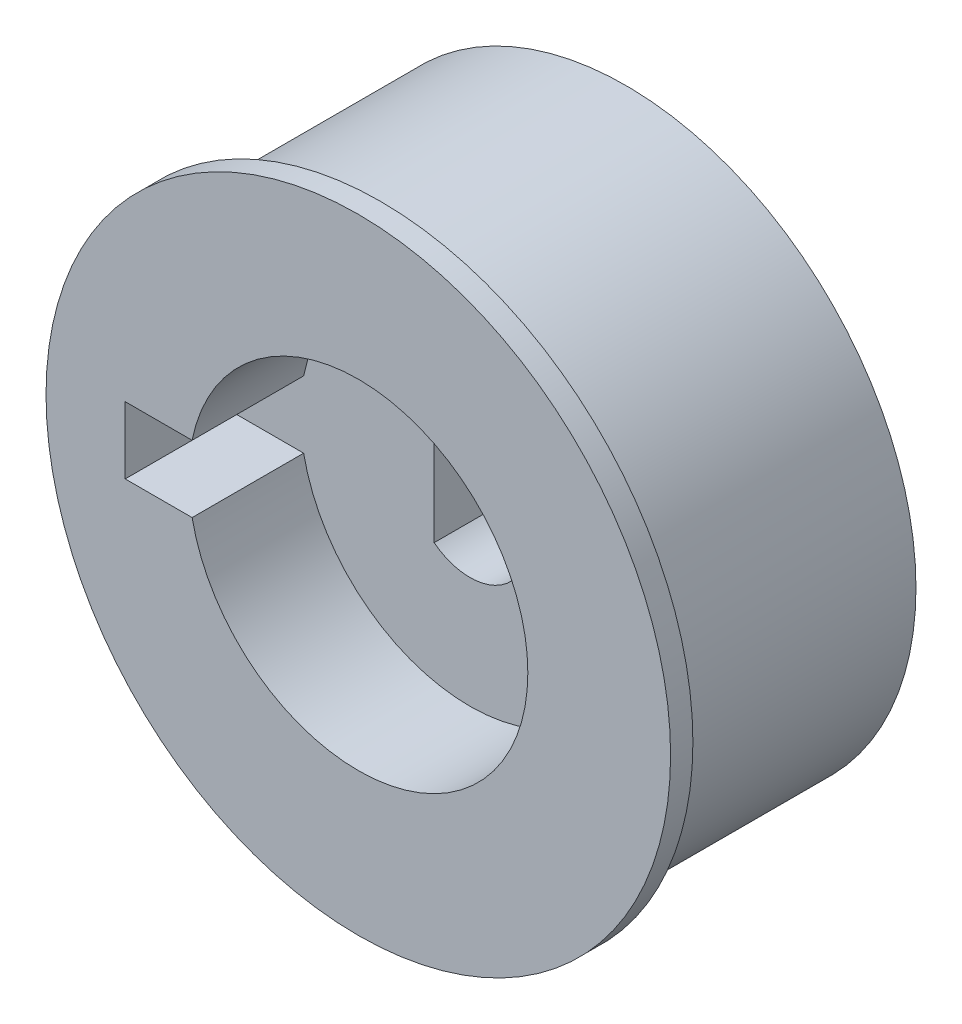
ISO-10303-21;
HEADER;
FILE_DESCRIPTION(('STEP AP214'),'2;1');
FILE_NAME('part.step','',(''),(''),'','','');
FILE_SCHEMA(('AUTOMOTIVE_DESIGN { 1 0 10303 214 1 1 1 1 }'));
ENDSEC;
DATA;
#1=APPLICATION_CONTEXT('core data for automotive mechanical design processes');
#2=APPLICATION_PROTOCOL_DEFINITION('international standard','automotive_design',2000,#1);
#3=PRODUCT_CONTEXT('',#1,'mechanical');
#4=PRODUCT('Part','Part','',(#3));
#5=PRODUCT_RELATED_PRODUCT_CATEGORY('part','',(#4));
#6=PRODUCT_DEFINITION_FORMATION('','',#4);
#7=PRODUCT_DEFINITION_CONTEXT('part definition',#1,'design');
#8=PRODUCT_DEFINITION('design','',#6,#7);
#9=PRODUCT_DEFINITION_SHAPE('','',#8);
#10=(LENGTH_UNIT() NAMED_UNIT(*) SI_UNIT(.MILLI.,.METRE.));
#11=(NAMED_UNIT(*) PLANE_ANGLE_UNIT() SI_UNIT($,.RADIAN.));
#12=(NAMED_UNIT(*) SI_UNIT($,.STERADIAN.) SOLID_ANGLE_UNIT());
#13=UNCERTAINTY_MEASURE_WITH_UNIT(LENGTH_MEASURE(1.E-05),#10,'distance_accuracy_value','');
#14=(GEOMETRIC_REPRESENTATION_CONTEXT(3) GLOBAL_UNCERTAINTY_ASSIGNED_CONTEXT((#13)) GLOBAL_UNIT_ASSIGNED_CONTEXT((#10,
#11,#12)) REPRESENTATION_CONTEXT('',''));
#15=CARTESIAN_POINT('',(0.,0.,0.));
#16=DIRECTION('',(0.,0.,1.));
#17=DIRECTION('',(1.,0.,0.));
#18=AXIS2_PLACEMENT_3D('',#15,#16,#17);
#19=CARTESIAN_POINT('',(0.,0.,12.));
#20=DIRECTION('',(0.,0.,-1.));
#21=DIRECTION('',(-1.,0.,0.));
#22=AXIS2_PLACEMENT_3D('',#19,#20,#21);
#23=CYLINDRICAL_SURFACE('',#22,2.6);
#24=DIRECTION('',(0.,0.,-1.));
#25=VECTOR('',#24,1.);
#26=CARTESIAN_POINT('',(-1.6,-2.04939015319192,12.));
#27=LINE('',#26,#25);
#28=CARTESIAN_POINT('',(-1.6,-2.04939015319192,7.));
#29=VERTEX_POINT('',#28);
#30=CARTESIAN_POINT('',(-1.6,-2.04939015319192,4.));
#31=VERTEX_POINT('',#30);
#32=EDGE_CURVE('E501',#29,#31,#27,.T.);
#33=ORIENTED_EDGE('',*,*,#32,.F.);
#34=CARTESIAN_POINT('',(0.,0.,7.));
#35=DIRECTION('',(0.,0.,1.));
#36=DIRECTION('',(1.,0.,0.));
#37=AXIS2_PLACEMENT_3D('',#34,#35,#36);
#38=CIRCLE('',#37,2.6);
#39=CARTESIAN_POINT('',(-1.6,2.04939015319192,7.));
#40=VERTEX_POINT('',#39);
#41=EDGE_CURVE('E325',#40,#29,#38,.F.);
#42=ORIENTED_EDGE('',*,*,#41,.F.);
#43=DIRECTION('',(0.,0.,-1.));
#44=VECTOR('',#43,1.);
#45=CARTESIAN_POINT('',(-1.6,2.04939015319192,12.));
#46=LINE('',#45,#44);
#47=CARTESIAN_POINT('',(-1.6,2.04939015319192,4.));
#48=VERTEX_POINT('',#47);
#49=EDGE_CURVE('E495',#40,#48,#46,.T.);
#50=ORIENTED_EDGE('',*,*,#49,.T.);
#51=CARTESIAN_POINT('',(0.,0.,4.));
#52=DIRECTION('',(0.,0.,1.));
#53=DIRECTION('',(1.,0.,0.));
#54=AXIS2_PLACEMENT_3D('',#51,#52,#53);
#55=CIRCLE('',#54,2.6);
#56=EDGE_CURVE('E508',#48,#31,#55,.F.);
#57=ORIENTED_EDGE('',*,*,#56,.T.);
#58=EDGE_LOOP('',(#33,#42,#50,#57));
#59=FACE_BOUND('',#58,.T.);
#60=ADVANCED_FACE('F97',(#59),#23,.F.);
#61=CARTESIAN_POINT('',(-1.6,0.,12.));
#62=DIRECTION('',(1.,0.,0.));
#63=DIRECTION('',(0.,0.,-1.));
#64=AXIS2_PLACEMENT_3D('',#61,#62,#63);
#65=PLANE('',#64);
#66=ORIENTED_EDGE('',*,*,#49,.F.);
#67=DIRECTION('',(0.,1.,0.));
#68=VECTOR('',#67,1.);
#69=CARTESIAN_POINT('',(-1.6,0.,7.));
#70=LINE('',#69,#68);
#71=EDGE_CURVE('E328',#29,#40,#70,.T.);
#72=ORIENTED_EDGE('',*,*,#71,.F.);
#73=ORIENTED_EDGE('',*,*,#32,.T.);
#74=DIRECTION('',(0.,1.,0.));
#75=VECTOR('',#74,1.);
#76=CARTESIAN_POINT('',(-1.6,0.,4.));
#77=LINE('',#76,#75);
#78=EDGE_CURVE('E504',#31,#48,#77,.T.);
#79=ORIENTED_EDGE('',*,*,#78,.T.);
#80=EDGE_LOOP('',(#66,#72,#73,#79));
#81=FACE_BOUND('',#80,.T.);
#82=ADVANCED_FACE('F599',(#81),#65,.T.);
#83=CARTESIAN_POINT('',(0.,0.,12.));
#84=DIRECTION('',(0.,0.,1.));
#85=DIRECTION('',(1.,0.,0.));
#86=AXIS2_PLACEMENT_3D('',#83,#84,#85);
#87=PLANE('',#86);
#88=CARTESIAN_POINT('',(0.,0.,12.));
#89=DIRECTION('',(0.,0.,1.));
#90=DIRECTION('',(1.,0.,0.));
#91=AXIS2_PLACEMENT_3D('',#88,#89,#90);
#92=CIRCLE('',#91,14.);
#93=CARTESIAN_POINT('',(14.,0.,12.));
#94=VERTEX_POINT('',#93);
#95=EDGE_CURVE('E491',#94,#94,#92,.T.);
#96=ORIENTED_EDGE('',*,*,#95,.T.);
#97=EDGE_LOOP('',(#96));
#98=FACE_BOUND('',#97,.T.);
#99=CARTESIAN_POINT('',(0.,0.,12.));
#100=DIRECTION('',(0.,0.,1.));
#101=DIRECTION('',(1.,0.,0.));
#102=AXIS2_PLACEMENT_3D('',#99,#100,#101);
#103=CIRCLE('',#102,7.6);
#104=CARTESIAN_POINT('',(-7.45050333870135,-1.5,12.));
#105=VERTEX_POINT('',#104);
#106=CARTESIAN_POINT('',(-7.45050333870135,1.5,12.));
#107=VERTEX_POINT('',#106);
#108=EDGE_CURVE('E351',#105,#107,#103,.T.);
#109=ORIENTED_EDGE('',*,*,#108,.F.);
#110=DIRECTION('',(-1.,0.,0.));
#111=VECTOR('',#110,1.);
#112=CARTESIAN_POINT('',(0.,-1.5,12.));
#113=LINE('',#112,#111);
#114=CARTESIAN_POINT('',(-10.4505033387014,-1.5,12.));
#115=VERTEX_POINT('',#114);
#116=EDGE_CURVE('E324',#105,#115,#113,.T.);
#117=ORIENTED_EDGE('',*,*,#116,.T.);
#118=DIRECTION('',(0.,1.,0.));
#119=VECTOR('',#118,1.);
#120=CARTESIAN_POINT('',(-10.4505033387014,0.,12.));
#121=LINE('',#120,#119);
#122=CARTESIAN_POINT('',(-10.4505033387014,1.5,12.));
#123=VERTEX_POINT('',#122);
#124=EDGE_CURVE('E329',#115,#123,#121,.T.);
#125=ORIENTED_EDGE('',*,*,#124,.T.);
#126=DIRECTION('',(-1.,0.,0.));
#127=VECTOR('',#126,1.);
#128=CARTESIAN_POINT('',(0.,1.5,12.));
#129=LINE('',#128,#127);
#130=EDGE_CURVE('E355',#107,#123,#129,.T.);
#131=ORIENTED_EDGE('',*,*,#130,.F.);
#132=EDGE_LOOP('',(#109,#117,#125,#131));
#133=FACE_BOUND('',#132,.T.);
#134=ADVANCED_FACE('F605',(#98,#133),#87,.T.);
#135=CARTESIAN_POINT('',(0.,0.,4.));
#136=DIRECTION('',(0.,0.,-1.));
#137=DIRECTION('',(-1.,0.,0.));
#138=AXIS2_PLACEMENT_3D('',#135,#136,#137);
#139=CYLINDRICAL_SURFACE('',#138,13.);
#140=CARTESIAN_POINT('',(0.,0.,0.));
#141=DIRECTION('',(0.,0.,1.));
#142=DIRECTION('',(1.,0.,0.));
#143=AXIS2_PLACEMENT_3D('',#140,#141,#142);
#144=CIRCLE('',#143,13.);
#145=CARTESIAN_POINT('',(13.,0.,0.));
#146=VERTEX_POINT('',#145);
#147=EDGE_CURVE('E512',#146,#146,#144,.T.);
#148=ORIENTED_EDGE('',*,*,#147,.T.);
#149=EDGE_LOOP('',(#148));
#150=FACE_BOUND('',#149,.T.);
#151=CARTESIAN_POINT('',(0.,0.,11.));
#152=DIRECTION('',(0.,0.,1.));
#153=DIRECTION('',(1.,0.,0.));
#154=AXIS2_PLACEMENT_3D('',#151,#152,#153);
#155=CIRCLE('',#154,13.);
#156=CARTESIAN_POINT('',(13.,0.,11.));
#157=VERTEX_POINT('',#156);
#158=EDGE_CURVE('E517',#157,#157,#155,.T.);
#159=ORIENTED_EDGE('',*,*,#158,.F.);
#160=EDGE_LOOP('',(#159));
#161=FACE_BOUND('',#160,.T.);
#162=ADVANCED_FACE('F621',(#150,#161),#139,.T.);
#163=CARTESIAN_POINT('',(0.,0.,4.));
#164=DIRECTION('',(0.,0.,-1.));
#165=DIRECTION('',(-1.,0.,0.));
#166=AXIS2_PLACEMENT_3D('',#163,#164,#165);
#167=CYLINDRICAL_SURFACE('',#166,1.4);
#168=CARTESIAN_POINT('',(0.,0.,2.));
#169=DIRECTION('',(0.,0.,1.));
#170=DIRECTION('',(1.,0.,0.));
#171=AXIS2_PLACEMENT_3D('',#168,#169,#170);
#172=CIRCLE('',#171,1.4);
#173=CARTESIAN_POINT('',(1.4,0.,2.));
#174=VERTEX_POINT('',#173);
#175=EDGE_CURVE('E283',#174,#174,#172,.T.);
#176=ORIENTED_EDGE('',*,*,#175,.F.);
#177=EDGE_LOOP('',(#176));
#178=FACE_BOUND('',#177,.T.);
#179=CARTESIAN_POINT('',(0.,0.,4.));
#180=DIRECTION('',(0.,0.,1.));
#181=DIRECTION('',(1.,0.,0.));
#182=AXIS2_PLACEMENT_3D('',#179,#180,#181);
#183=CIRCLE('',#182,1.4);
#184=CARTESIAN_POINT('',(1.4,0.,4.));
#185=VERTEX_POINT('',#184);
#186=EDGE_CURVE('E513',#185,#185,#183,.T.);
#187=ORIENTED_EDGE('',*,*,#186,.T.);
#188=EDGE_LOOP('',(#187));
#189=FACE_BOUND('',#188,.T.);
#190=ADVANCED_FACE('F615',(#178,#189),#167,.F.);
#191=CARTESIAN_POINT('',(0.,0.,4.));
#192=DIRECTION('',(0.,0.,1.));
#193=DIRECTION('',(1.,0.,0.));
#194=AXIS2_PLACEMENT_3D('',#191,#192,#193);
#195=PLANE('',#194);
#196=ORIENTED_EDGE('',*,*,#56,.F.);
#197=ORIENTED_EDGE('',*,*,#78,.F.);
#198=EDGE_LOOP('',(#196,#197));
#199=FACE_BOUND('',#198,.T.);
#200=ORIENTED_EDGE('',*,*,#186,.F.);
#201=EDGE_LOOP('',(#200));
#202=FACE_BOUND('',#201,.T.);
#203=ADVANCED_FACE('F611',(#199,#202),#195,.T.);
#204=CARTESIAN_POINT('',(0.,0.,0.));
#205=DIRECTION('',(0.,0.,1.));
#206=DIRECTION('',(1.,0.,0.));
#207=AXIS2_PLACEMENT_3D('',#204,#205,#206);
#208=PLANE('',#207);
#209=DIRECTION('',(-0.866025403784429,-0.500000000000016,0.));
#210=VECTOR('',#209,1.);
#211=CARTESIAN_POINT('',(-0.375000000000013,0.649519052838322,0.));
#212=LINE('',#211,#210);
#213=CARTESIAN_POINT('',(-10.4287304944647,-5.15500495450106,0.));
#214=VERTEX_POINT('',#213);
#215=CARTESIAN_POINT('',(-10.7469875144544,-5.33875073066362,0.));
#216=VERTEX_POINT('',#215);
#217=EDGE_CURVE('E386',#214,#216,#212,.T.);
#218=ORIENTED_EDGE('',*,*,#217,.F.);
#219=CARTESIAN_POINT('',(0.,0.,0.));
#220=DIRECTION('',(0.,0.,1.));
#221=DIRECTION('',(1.,0.,0.));
#222=AXIS2_PLACEMENT_3D('',#219,#220,#221);
#223=CIRCLE('',#222,11.6332495807108);
#224=CARTESIAN_POINT('',(-9.67873049446467,-6.45404306017771,0.));
#225=VERTEX_POINT('',#224);
#226=EDGE_CURVE('E671',#214,#225,#223,.T.);
#227=ORIENTED_EDGE('',*,*,#226,.T.);
#228=DIRECTION('',(-0.866025403784429,-0.500000000000016,0.));
#229=VECTOR('',#228,1.);
#230=CARTESIAN_POINT('',(0.375000000000013,-0.649519052838324,0.));
#231=LINE('',#230,#229);
#232=CARTESIAN_POINT('',(-9.99698751445438,-6.63778883634026,0.));
#233=VERTEX_POINT('',#232);
#234=EDGE_CURVE('E416',#225,#233,#231,.T.);
#235=ORIENTED_EDGE('',*,*,#234,.T.);
#236=CARTESIAN_POINT('',(0.,0.,0.));
#237=DIRECTION('',(0.,0.,-1.));
#238=DIRECTION('',(-1.,0.,0.));
#239=AXIS2_PLACEMENT_3D('',#236,#237,#238);
#240=CIRCLE('',#239,12.);
#241=CARTESIAN_POINT('',(9.99698751445451,-6.63778883634007,0.));
#242=VERTEX_POINT('',#241);
#243=EDGE_CURVE('E421',#242,#233,#240,.T.);
#244=ORIENTED_EDGE('',*,*,#243,.F.);
#245=DIRECTION('',(0.866025403784432,-0.500000000000011,0.));
#246=VECTOR('',#245,1.);
#247=CARTESIAN_POINT('',(-0.374999999999925,-0.64951905283818,0.));
#248=LINE('',#247,#246);
#249=CARTESIAN_POINT('',(9.67873049446479,-6.45404306017751,0.));
#250=VERTEX_POINT('',#249);
#251=EDGE_CURVE('E426',#250,#242,#248,.T.);
#252=ORIENTED_EDGE('',*,*,#251,.F.);
#253=CARTESIAN_POINT('',(0.,0.,0.));
#254=DIRECTION('',(0.,0.,1.));
#255=DIRECTION('',(1.,0.,0.));
#256=AXIS2_PLACEMENT_3D('',#253,#254,#255);
#257=CIRCLE('',#256,11.6332495807108);
#258=CARTESIAN_POINT('',(10.4287304944648,-5.15500495450085,0.));
#259=VERTEX_POINT('',#258);
#260=EDGE_CURVE('E119',#250,#259,#257,.T.);
#261=ORIENTED_EDGE('',*,*,#260,.T.);
#262=DIRECTION('',(0.866025403784432,-0.500000000000012,0.));
#263=VECTOR('',#262,1.);
#264=CARTESIAN_POINT('',(0.375000000000093,0.64951905283847,0.));
#265=LINE('',#264,#263);
#266=CARTESIAN_POINT('',(10.7469875144545,-5.33875073066341,0.));
#267=VERTEX_POINT('',#266);
#268=EDGE_CURVE('E271',#259,#267,#265,.T.);
#269=ORIENTED_EDGE('',*,*,#268,.T.);
#270=CARTESIAN_POINT('',(0.,0.,0.));
#271=DIRECTION('',(0.,0.,-1.));
#272=DIRECTION('',(-1.,0.,0.));
#273=AXIS2_PLACEMENT_3D('',#270,#271,#272);
#274=CIRCLE('',#273,12.);
#275=CARTESIAN_POINT('',(0.75,11.9765395670035,0.));
#276=VERTEX_POINT('',#275);
#277=EDGE_CURVE('E459',#276,#267,#274,.T.);
#278=ORIENTED_EDGE('',*,*,#277,.F.);
#279=DIRECTION('',(0.,1.,0.));
#280=VECTOR('',#279,1.);
#281=CARTESIAN_POINT('',(0.75,0.,0.));
#282=LINE('',#281,#280);
#283=CARTESIAN_POINT('',(0.75,11.6090480146784,0.));
#284=VERTEX_POINT('',#283);
#285=EDGE_CURVE('E464',#284,#276,#282,.T.);
#286=ORIENTED_EDGE('',*,*,#285,.F.);
#287=CARTESIAN_POINT('',(0.,0.,0.));
#288=DIRECTION('',(0.,0.,1.));
#289=DIRECTION('',(1.,0.,0.));
#290=AXIS2_PLACEMENT_3D('',#287,#288,#289);
#291=CIRCLE('',#290,11.6332495807108);
#292=CARTESIAN_POINT('',(-0.75,11.6090480146784,0.));
#293=VERTEX_POINT('',#292);
#294=EDGE_CURVE('E536',#284,#293,#291,.T.);
#295=ORIENTED_EDGE('',*,*,#294,.T.);
#296=DIRECTION('',(0.,1.,0.));
#297=VECTOR('',#296,1.);
#298=CARTESIAN_POINT('',(-0.75,0.,0.));
#299=LINE('',#298,#297);
#300=CARTESIAN_POINT('',(-0.75,11.9765395670035,0.));
#301=VERTEX_POINT('',#300);
#302=EDGE_CURVE('E376',#293,#301,#299,.T.);
#303=ORIENTED_EDGE('',*,*,#302,.T.);
#304=CARTESIAN_POINT('',(0.,0.,0.));
#305=DIRECTION('',(0.,0.,-1.));
#306=DIRECTION('',(-1.,0.,0.));
#307=AXIS2_PLACEMENT_3D('',#304,#305,#306);
#308=CIRCLE('',#307,12.);
#309=EDGE_CURVE('E381',#216,#301,#308,.T.);
#310=ORIENTED_EDGE('',*,*,#309,.F.);
#311=EDGE_LOOP('',(#218,#227,#235,#244,#252,#261,#269,#278,#286,#295,#303,#310));
#312=FACE_BOUND('',#311,.T.);
#313=ORIENTED_EDGE('',*,*,#147,.F.);
#314=EDGE_LOOP('',(#313));
#315=FACE_BOUND('',#314,.T.);
#316=ADVANCED_FACE('F614',(#312,#315),#208,.F.);
#317=CARTESIAN_POINT('',(0.,0.,12.));
#318=DIRECTION('',(0.,0.,-1.));
#319=DIRECTION('',(-1.,0.,0.));
#320=AXIS2_PLACEMENT_3D('',#317,#318,#319);
#321=CYLINDRICAL_SURFACE('',#320,14.);
#322=ORIENTED_EDGE('',*,*,#95,.F.);
#323=EDGE_LOOP('',(#322));
#324=FACE_BOUND('',#323,.T.);
#325=CARTESIAN_POINT('',(0.,0.,11.));
#326=DIRECTION('',(0.,0.,1.));
#327=DIRECTION('',(1.,0.,0.));
#328=AXIS2_PLACEMENT_3D('',#325,#326,#327);
#329=CIRCLE('',#328,14.);
#330=CARTESIAN_POINT('',(14.,0.,11.));
#331=VERTEX_POINT('',#330);
#332=EDGE_CURVE('E490',#331,#331,#329,.T.);
#333=ORIENTED_EDGE('',*,*,#332,.T.);
#334=EDGE_LOOP('',(#333));
#335=FACE_BOUND('',#334,.T.);
#336=ADVANCED_FACE('F619',(#324,#335),#321,.T.);
#337=CARTESIAN_POINT('',(0.,0.,11.));
#338=DIRECTION('',(0.,0.,1.));
#339=DIRECTION('',(1.,0.,0.));
#340=AXIS2_PLACEMENT_3D('',#337,#338,#339);
#341=PLANE('',#340);
#342=ORIENTED_EDGE('',*,*,#158,.T.);
#343=EDGE_LOOP('',(#342));
#344=FACE_BOUND('',#343,.T.);
#345=ORIENTED_EDGE('',*,*,#332,.F.);
#346=EDGE_LOOP('',(#345));
#347=FACE_BOUND('',#346,.T.);
#348=ADVANCED_FACE('F633',(#344,#347),#341,.F.);
#349=CARTESIAN_POINT('',(0.,0.,5.));
#350=DIRECTION('',(0.,0.,1.));
#351=DIRECTION('',(1.,0.,0.));
#352=AXIS2_PLACEMENT_3D('',#349,#350,#351);
#353=PLANE('',#352);
#354=DIRECTION('',(0.,1.,0.));
#355=VECTOR('',#354,1.);
#356=CARTESIAN_POINT('',(0.75,0.,5.));
#357=LINE('',#356,#355);
#358=CARTESIAN_POINT('',(0.75,4.53844687090198,5.));
#359=VERTEX_POINT('',#358);
#360=CARTESIAN_POINT('',(0.75,11.9765395670035,5.));
#361=VERTEX_POINT('',#360);
#362=EDGE_CURVE('E472',#359,#361,#357,.T.);
#363=ORIENTED_EDGE('',*,*,#362,.T.);
#364=CARTESIAN_POINT('',(0.,0.,5.));
#365=DIRECTION('',(0.,0.,1.));
#366=DIRECTION('',(1.,0.,0.));
#367=AXIS2_PLACEMENT_3D('',#364,#365,#366);
#368=CIRCLE('',#367,12.);
#369=CARTESIAN_POINT('',(10.7469875144545,-5.33875073066341,5.));
#370=VERTEX_POINT('',#369);
#371=EDGE_CURVE('E463',#361,#370,#368,.F.);
#372=ORIENTED_EDGE('',*,*,#371,.T.);
#373=DIRECTION('',(0.866025403784432,-0.500000000000012,0.));
#374=VECTOR('',#373,1.);
#375=CARTESIAN_POINT('',(0.375000000000093,0.64951905283847,5.));
#376=LINE('',#375,#374);
#377=CARTESIAN_POINT('',(4.30541028392715,-1.61970438261256,5.));
#378=VERTEX_POINT('',#377);
#379=EDGE_CURVE('E467',#378,#370,#376,.T.);
#380=ORIENTED_EDGE('',*,*,#379,.F.);
#381=CARTESIAN_POINT('',(0.,0.,5.));
#382=DIRECTION('',(0.,0.,1.));
#383=DIRECTION('',(1.,0.,0.));
#384=AXIS2_PLACEMENT_3D('',#381,#382,#383);
#385=CIRCLE('',#384,4.6);
#386=EDGE_CURVE('E455',#359,#378,#385,.F.);
#387=ORIENTED_EDGE('',*,*,#386,.F.);
#388=EDGE_LOOP('',(#363,#372,#380,#387));
#389=FACE_BOUND('',#388,.T.);
#390=ADVANCED_FACE('F636',(#389),#353,.F.);
#391=CARTESIAN_POINT('',(0.,0.,33.9596966156328));
#392=DIRECTION('',(0.,0.,-1.));
#393=DIRECTION('',(-1.,0.,0.));
#394=AXIS2_PLACEMENT_3D('',#391,#392,#393);
#395=CYLINDRICAL_SURFACE('',#394,12.);
#396=DIRECTION('',(0.,0.,-1.));
#397=VECTOR('',#396,1.);
#398=CARTESIAN_POINT('',(0.75,11.9765395670035,33.9596966156328));
#399=LINE('',#398,#397);
#400=EDGE_CURVE('E476',#361,#276,#399,.T.);
#401=ORIENTED_EDGE('',*,*,#400,.T.);
#402=ORIENTED_EDGE('',*,*,#277,.T.);
#403=DIRECTION('',(0.,0.,-1.));
#404=VECTOR('',#403,1.);
#405=CARTESIAN_POINT('',(10.7469875144545,-5.33875073066341,33.9596966156328));
#406=LINE('',#405,#404);
#407=EDGE_CURVE('E471',#370,#267,#406,.T.);
#408=ORIENTED_EDGE('',*,*,#407,.F.);
#409=ORIENTED_EDGE('',*,*,#371,.F.);
#410=EDGE_LOOP('',(#401,#402,#408,#409));
#411=FACE_BOUND('',#410,.T.);
#412=ADVANCED_FACE('F649',(#411),#395,.F.);
#413=CARTESIAN_POINT('',(0.375000000000093,0.64951905283847,33.9596966156328));
#414=DIRECTION('',(0.500000000000012,0.866025403784432,0.));
#415=DIRECTION('',(-0.866025403784432,0.500000000000012,0.));
#416=AXIS2_PLACEMENT_3D('',#413,#414,#415);
#417=PLANE('',#416);
#418=ORIENTED_EDGE('',*,*,#268,.F.);
#419=CARTESIAN_POINT('',(10.4287304944648,-5.15500495450085,0.));
#420=CARTESIAN_POINT('',(10.1312042262057,-4.9832280834305,-4.18353302775018E-05));
#421=CARTESIAN_POINT('',(9.83368081164115,-4.81145285994141,0.0146900329256624));
#422=CARTESIAN_POINT('',(9.24077476566226,-4.46913839469133,0.0733775169514432));
#423=CARTESIAN_POINT('',(8.94539233244648,-4.29859926736031,0.117335804253457));
#424=CARTESIAN_POINT('',(8.36589995423224,-3.96402918680497,0.232769633331213));
#425=CARTESIAN_POINT('',(8.08168869222404,-3.79993973817781,0.303569112871464));
#426=CARTESIAN_POINT('',(7.51938466553235,-3.47529335700094,0.472143949845235));
#427=CARTESIAN_POINT('',(7.24129042056458,-3.31473556980871,0.569912701563236));
#428=CARTESIAN_POINT('',(6.765729624024,-3.04017041590996,0.762271236609839));
#429=CARTESIAN_POINT('',(6.56641837481452,-2.92509801252634,0.85084312114458));
#430=CARTESIAN_POINT('',(6.17281342365751,-2.69785008802147,1.04177444744678));
#431=CARTESIAN_POINT('',(5.97851945865076,-2.5856744150229,1.14413316460604));
#432=CARTESIAN_POINT('',(5.59223707930897,-2.3626541793267,1.36415151266648));
#433=CARTESIAN_POINT('',(5.40035116164338,-2.25186879310877,1.48205093923393));
#434=CARTESIAN_POINT('',(5.02314416644525,-2.03408823289092,1.73117049838268));
#435=CARTESIAN_POINT('',(4.83782394212901,-1.92709355149565,1.86239235371987));
#436=CARTESIAN_POINT('',(4.65613594738597,-1.82219593882222,2.));
#437=B_SPLINE_CURVE_WITH_KNOTS('',3,(#419,#420,#421,#422,#423,#424,#425,#426,#427,#428,#429,
#430,#431,#432,#433,#434,#435,#436),.UNSPECIFIED.,.F.,.F.,(4,2,2,2,2,2,2,2,4),(0.,
1.03034431508331,2.06078282495963,3.06682736134476,4.07262570079603,4.81200093428171,
5.55133732284493,6.30382570151409,7.0564115105371),.UNSPECIFIED.);
#438=CARTESIAN_POINT('',(4.65613594738597,-1.82219593882222,2.));
#439=VERTEX_POINT('',#438);
#440=EDGE_CURVE('E264',#259,#439,#437,.T.);
#441=ORIENTED_EDGE('',*,*,#440,.T.);
#442=DIRECTION('',(0.866025403784432,-0.500000000000012,0.));
#443=VECTOR('',#442,1.);
#444=CARTESIAN_POINT('',(0.375000000000093,0.64951905283847,2.));
#445=LINE('',#444,#443);
#446=CARTESIAN_POINT('',(4.30541028392715,-1.61970438261256,2.));
#447=VERTEX_POINT('',#446);
#448=EDGE_CURVE('E268',#447,#439,#445,.T.);
#449=ORIENTED_EDGE('',*,*,#448,.F.);
#450=DIRECTION('',(0.,0.,-1.));
#451=VECTOR('',#450,1.);
#452=CARTESIAN_POINT('',(4.30541028392715,-1.61970438261256,33.9596966156328));
#453=LINE('',#452,#451);
#454=EDGE_CURVE('E458',#378,#447,#453,.T.);
#455=ORIENTED_EDGE('',*,*,#454,.F.);
#456=ORIENTED_EDGE('',*,*,#379,.T.);
#457=ORIENTED_EDGE('',*,*,#407,.T.);
#458=EDGE_LOOP('',(#418,#441,#449,#455,#456,#457));
#459=FACE_BOUND('',#458,.T.);
#460=ADVANCED_FACE('F266',(#459),#417,.T.);
#461=CARTESIAN_POINT('',(0.,0.,33.9596966156328));
#462=DIRECTION('',(0.,0.,-1.));
#463=DIRECTION('',(-1.,0.,0.));
#464=AXIS2_PLACEMENT_3D('',#461,#462,#463);
#465=CYLINDRICAL_SURFACE('',#464,4.6);
#466=CARTESIAN_POINT('',(0.,0.,2.));
#467=DIRECTION('',(0.,0.,1.));
#468=DIRECTION('',(1.,0.,0.));
#469=AXIS2_PLACEMENT_3D('',#466,#467,#468);
#470=CIRCLE('',#469,4.6);
#471=CARTESIAN_POINT('',(0.75,4.53844687090198,2.));
#472=VERTEX_POINT('',#471);
#473=EDGE_CURVE('E281',#472,#447,#470,.F.);
#474=ORIENTED_EDGE('',*,*,#473,.F.);
#475=DIRECTION('',(0.,0.,-1.));
#476=VECTOR('',#475,1.);
#477=CARTESIAN_POINT('',(0.75,4.53844687090198,33.9596966156328));
#478=LINE('',#477,#476);
#479=EDGE_CURVE('E311',#359,#472,#478,.T.);
#480=ORIENTED_EDGE('',*,*,#479,.F.);
#481=ORIENTED_EDGE('',*,*,#386,.T.);
#482=ORIENTED_EDGE('',*,*,#454,.T.);
#483=EDGE_LOOP('',(#474,#480,#481,#482));
#484=FACE_BOUND('',#483,.T.);
#485=ADVANCED_FACE('F656',(#484),#465,.T.);
#486=CARTESIAN_POINT('',(0.75,0.,33.9596966156328));
#487=DIRECTION('',(-1.,0.,0.));
#488=DIRECTION('',(0.,0.,1.));
#489=AXIS2_PLACEMENT_3D('',#486,#487,#488);
#490=PLANE('',#489);
#491=DIRECTION('',(0.,1.,0.));
#492=VECTOR('',#491,1.);
#493=CARTESIAN_POINT('',(0.75,0.,2.));
#494=LINE('',#493,#492);
#495=CARTESIAN_POINT('',(0.75,4.9434299833213,2.));
#496=VERTEX_POINT('',#495);
#497=EDGE_CURVE('E301',#472,#496,#494,.T.);
#498=ORIENTED_EDGE('',*,*,#497,.T.);
#499=CARTESIAN_POINT('',(0.75,4.9434299833213,2.));
#500=CARTESIAN_POINT('',(0.75,5.0893474821141,1.90430312472398));
#501=CARTESIAN_POINT('',(0.75,5.23726701669011,1.81169705960343));
#502=CARTESIAN_POINT('',(0.75,5.53690051696032,1.63283795454836));
#503=CARTESIAN_POINT('',(0.75,5.68861452876567,1.54658499186814));
#504=CARTESIAN_POINT('',(0.75,6.14913504735836,1.29761266497216));
#505=CARTESIAN_POINT('',(0.75,6.4633137120764,1.14468401311426));
#506=CARTESIAN_POINT('',(0.75,7.0958536228182,0.869710166692756));
#507=CARTESIAN_POINT('',(0.75,7.41393130203221,0.747009152436511));
#508=CARTESIAN_POINT('',(0.75,8.05921576711693,0.528796518198928));
#509=CARTESIAN_POINT('',(0.75,8.38641967939893,0.433276443510317));
#510=CARTESIAN_POINT('',(0.75,8.95127464357346,0.293933085677098));
#511=CARTESIAN_POINT('',(0.75,9.18723710837479,0.243156349625265));
#512=CARTESIAN_POINT('',(0.75,9.66177503960559,0.155811064934727));
#513=CARTESIAN_POINT('',(0.75,9.90035033047808,0.119241567654459));
#514=CARTESIAN_POINT('',(0.75,10.3834396548991,0.0599523100500162));
#515=CARTESIAN_POINT('',(0.75,10.6279846864505,0.0374852761956584));
#516=CARTESIAN_POINT('',(0.75,11.1180347856713,0.00750262551528834));
#517=CARTESIAN_POINT('',(0.75,11.3635400228252,-1.02202742368984E-05));
#518=CARTESIAN_POINT('',(0.75,11.6090480146784,0.));
#519=B_SPLINE_CURVE_WITH_KNOTS('',3,(#499,#500,#501,#502,#503,#504,#505,#506,#507,#508,#509,
#510,#511,#512,#513,#514,#515,#516,#517,#518),.UNSPECIFIED.,.F.,.F.,(4,2,2,2,2,2,2,2,2,4),(0.,
0.5234146608248,1.04683568536811,2.09370035793107,3.11531996853505,4.13662145326538,
4.860314567637,5.58395935147662,6.3202275772696,7.05663222212104),.UNSPECIFIED.);
#520=EDGE_CURVE('E112',#496,#284,#519,.T.);
#521=ORIENTED_EDGE('',*,*,#520,.T.);
#522=ORIENTED_EDGE('',*,*,#285,.T.);
#523=ORIENTED_EDGE('',*,*,#400,.F.);
#524=ORIENTED_EDGE('',*,*,#362,.F.);
#525=ORIENTED_EDGE('',*,*,#479,.T.);
#526=EDGE_LOOP('',(#498,#521,#522,#523,#524,#525));
#527=FACE_BOUND('',#526,.T.);
#528=ADVANCED_FACE('F308',(#527),#490,.F.);
#529=CARTESIAN_POINT('',(0.,0.,5.));
#530=DIRECTION('',(0.,0.,1.));
#531=DIRECTION('',(1.,0.,0.));
#532=AXIS2_PLACEMENT_3D('',#529,#530,#531);
#533=PLANE('',#532);
#534=DIRECTION('',(-0.866025403784429,-0.500000000000016,0.));
#535=VECTOR('',#534,1.);
#536=CARTESIAN_POINT('',(-0.375000000000013,0.649519052838322,5.));
#537=LINE('',#536,#535);
#538=CARTESIAN_POINT('',(-4.30541028392708,-1.61970438261274,5.));
#539=VERTEX_POINT('',#538);
#540=CARTESIAN_POINT('',(-10.7469875144544,-5.33875073066362,5.));
#541=VERTEX_POINT('',#540);
#542=EDGE_CURVE('E394',#539,#541,#537,.T.);
#543=ORIENTED_EDGE('',*,*,#542,.T.);
#544=CARTESIAN_POINT('',(0.,0.,5.));
#545=DIRECTION('',(0.,0.,1.));
#546=DIRECTION('',(1.,0.,0.));
#547=AXIS2_PLACEMENT_3D('',#544,#545,#546);
#548=CIRCLE('',#547,12.);
#549=CARTESIAN_POINT('',(-0.75,11.9765395670035,5.));
#550=VERTEX_POINT('',#549);
#551=EDGE_CURVE('E385',#541,#550,#548,.F.);
#552=ORIENTED_EDGE('',*,*,#551,.T.);
#553=DIRECTION('',(0.,1.,0.));
#554=VECTOR('',#553,1.);
#555=CARTESIAN_POINT('',(-0.75,0.,5.));
#556=LINE('',#555,#554);
#557=CARTESIAN_POINT('',(-0.75,4.53844687090198,5.));
#558=VERTEX_POINT('',#557);
#559=EDGE_CURVE('E389',#558,#550,#556,.T.);
#560=ORIENTED_EDGE('',*,*,#559,.F.);
#561=CARTESIAN_POINT('',(0.,0.,5.));
#562=DIRECTION('',(0.,0.,1.));
#563=DIRECTION('',(1.,0.,0.));
#564=AXIS2_PLACEMENT_3D('',#561,#562,#563);
#565=CIRCLE('',#564,4.6);
#566=EDGE_CURVE('E366',#539,#558,#565,.F.);
#567=ORIENTED_EDGE('',*,*,#566,.F.);
#568=EDGE_LOOP('',(#543,#552,#560,#567));
#569=FACE_BOUND('',#568,.T.);
#570=ADVANCED_FACE('F561',(#569),#533,.F.);
#571=CARTESIAN_POINT('',(0.,0.,33.9596966156328));
#572=DIRECTION('',(0.,0.,-1.));
#573=DIRECTION('',(-1.,0.,0.));
#574=AXIS2_PLACEMENT_3D('',#571,#572,#573);
#575=CYLINDRICAL_SURFACE('',#574,12.);
#576=DIRECTION('',(0.,0.,-1.));
#577=VECTOR('',#576,1.);
#578=CARTESIAN_POINT('',(-10.7469875144544,-5.33875073066362,33.9596966156328));
#579=LINE('',#578,#577);
#580=EDGE_CURVE('E398',#541,#216,#579,.T.);
#581=ORIENTED_EDGE('',*,*,#580,.T.);
#582=ORIENTED_EDGE('',*,*,#309,.T.);
#583=DIRECTION('',(0.,0.,-1.));
#584=VECTOR('',#583,1.);
#585=CARTESIAN_POINT('',(-0.75,11.9765395670035,33.9596966156328));
#586=LINE('',#585,#584);
#587=EDGE_CURVE('E393',#550,#301,#586,.T.);
#588=ORIENTED_EDGE('',*,*,#587,.F.);
#589=ORIENTED_EDGE('',*,*,#551,.F.);
#590=EDGE_LOOP('',(#581,#582,#588,#589));
#591=FACE_BOUND('',#590,.T.);
#592=ADVANCED_FACE('F557',(#591),#575,.F.);
#593=CARTESIAN_POINT('',(-0.75,0.,33.9596966156328));
#594=DIRECTION('',(-1.,0.,0.));
#595=DIRECTION('',(0.,0.,1.));
#596=AXIS2_PLACEMENT_3D('',#593,#594,#595);
#597=PLANE('',#596);
#598=ORIENTED_EDGE('',*,*,#302,.F.);
#599=CARTESIAN_POINT('',(-0.75,11.6090480146784,0.));
#600=CARTESIAN_POINT('',(-0.75,11.2654942725377,-4.18353302753854E-05));
#601=CARTESIAN_POINT('',(-0.75,10.9219438255595,0.0146900329256642));
#602=CARTESIAN_POINT('',(-0.75,10.2373148950594,0.0733775169514432));
#603=CARTESIAN_POINT('',(-0.75,9.89623664039735,0.117335804253456));
#604=CARTESIAN_POINT('',(-0.75,9.22709647928668,0.232769633331211));
#605=CARTESIAN_POINT('',(-0.75,8.89891758203237,0.303569112871464));
#606=CARTESIAN_POINT('',(-0.75,8.24962481967865,0.472143949845235));
#607=CARTESIAN_POINT('',(-0.75,7.92850924529419,0.569912701563235));
#608=CARTESIAN_POINT('',(-0.75,7.37937893749672,0.762271236609837));
#609=CARTESIAN_POINT('',(-0.75,7.14923413072948,0.850843121144579));
#610=CARTESIAN_POINT('',(-0.75,6.69473828171975,1.04177444744678));
#611=CARTESIAN_POINT('',(-0.75,6.47038693572262,1.14413316460604));
#612=CARTESIAN_POINT('',(-0.75,6.02434646433023,1.36415151266648));
#613=CARTESIAN_POINT('',(-0.75,5.80277569189437,1.48205093923393));
#614=CARTESIAN_POINT('',(-0.75,5.36721457145867,1.73117049838267));
#615=CARTESIAN_POINT('',(-0.75,5.15322520866814,1.86239235371987));
#616=CARTESIAN_POINT('',(-0.75,4.9434299833213,2.));
#617=B_SPLINE_CURVE_WITH_KNOTS('',3,(#599,#600,#601,#602,#603,#604,#605,#606,#607,#608,#609,
#610,#611,#612,#613,#614,#615,#616),.UNSPECIFIED.,.F.,.F.,(4,2,2,2,2,2,2,2,4),(0.,
1.0303443150833,2.06078282495963,3.06682736134476,4.07262570079602,4.8120009342817,
5.55133732284492,6.30382570151408,7.05641151053708),.UNSPECIFIED.);
#618=CARTESIAN_POINT('',(-0.75,4.9434299833213,2.));
#619=VERTEX_POINT('',#618);
#620=EDGE_CURVE('E13',#293,#619,#617,.T.);
#621=ORIENTED_EDGE('',*,*,#620,.T.);
#622=DIRECTION('',(0.,1.,0.));
#623=VECTOR('',#622,1.);
#624=CARTESIAN_POINT('',(-0.75,0.,2.));
#625=LINE('',#624,#623);
#626=CARTESIAN_POINT('',(-0.75,4.53844687090198,2.));
#627=VERTEX_POINT('',#626);
#628=EDGE_CURVE('E303',#627,#619,#625,.T.);
#629=ORIENTED_EDGE('',*,*,#628,.F.);
#630=DIRECTION('',(0.,0.,-1.));
#631=VECTOR('',#630,1.);
#632=CARTESIAN_POINT('',(-0.75,4.53844687090198,33.9596966156328));
#633=LINE('',#632,#631);
#634=EDGE_CURVE('E380',#558,#627,#633,.T.);
#635=ORIENTED_EDGE('',*,*,#634,.F.);
#636=ORIENTED_EDGE('',*,*,#559,.T.);
#637=ORIENTED_EDGE('',*,*,#587,.T.);
#638=EDGE_LOOP('',(#598,#621,#629,#635,#636,#637));
#639=FACE_BOUND('',#638,.T.);
#640=ADVANCED_FACE('F552',(#639),#597,.T.);
#641=CARTESIAN_POINT('',(0.,0.,33.9596966156328));
#642=DIRECTION('',(0.,0.,-1.));
#643=DIRECTION('',(-1.,0.,0.));
#644=AXIS2_PLACEMENT_3D('',#641,#642,#643);
#645=CYLINDRICAL_SURFACE('',#644,4.6);
#646=CARTESIAN_POINT('',(0.,0.,2.));
#647=DIRECTION('',(0.,0.,1.));
#648=DIRECTION('',(1.,0.,0.));
#649=AXIS2_PLACEMENT_3D('',#646,#647,#648);
#650=CIRCLE('',#649,4.6);
#651=CARTESIAN_POINT('',(-4.30541028392708,-1.61970438261274,2.));
#652=VERTEX_POINT('',#651);
#653=EDGE_CURVE('E317',#652,#627,#650,.F.);
#654=ORIENTED_EDGE('',*,*,#653,.F.);
#655=DIRECTION('',(0.,0.,-1.));
#656=VECTOR('',#655,1.);
#657=CARTESIAN_POINT('',(-4.30541028392708,-1.61970438261274,33.9596966156328));
#658=LINE('',#657,#656);
#659=EDGE_CURVE('E379',#539,#652,#658,.T.);
#660=ORIENTED_EDGE('',*,*,#659,.F.);
#661=ORIENTED_EDGE('',*,*,#566,.T.);
#662=ORIENTED_EDGE('',*,*,#634,.T.);
#663=EDGE_LOOP('',(#654,#660,#661,#662));
#664=FACE_BOUND('',#663,.T.);
#665=ADVANCED_FACE('F547',(#664),#645,.T.);
#666=CARTESIAN_POINT('',(-0.375000000000013,0.649519052838322,33.9596966156328));
#667=DIRECTION('',(0.500000000000016,-0.866025403784429,0.));
#668=DIRECTION('',(0.866025403784429,0.500000000000016,0.));
#669=AXIS2_PLACEMENT_3D('',#666,#667,#668);
#670=PLANE('',#669);
#671=DIRECTION('',(-0.866025403784429,-0.500000000000016,0.));
#672=VECTOR('',#671,1.);
#673=CARTESIAN_POINT('',(-0.375000000000013,0.649519052838322,2.));
#674=LINE('',#673,#672);
#675=CARTESIAN_POINT('',(-4.65613594738589,-1.82219593882241,2.));
#676=VERTEX_POINT('',#675);
#677=EDGE_CURVE('E696',#652,#676,#674,.T.);
#678=ORIENTED_EDGE('',*,*,#677,.T.);
#679=CARTESIAN_POINT('',(-4.65613594738589,-1.82219593882241,2.));
#680=CARTESIAN_POINT('',(-4.78250420819714,-1.89515468821881,1.90430312472398));
#681=CARTESIAN_POINT('',(-4.91060628285594,-1.96911445550682,1.81169705960343));
#682=CARTESIAN_POINT('',(-5.17009650591479,-2.11893120564193,1.63283795454836));
#683=CARTESIAN_POINT('',(-5.30148469424827,-2.19478821154461,1.54658499186813));
#684=CARTESIAN_POINT('',(-5.70030716231352,-2.42504847084096,1.29761266497216));
#685=CARTESIAN_POINT('',(-5.97239386728641,-2.58213780319998,1.14468401311425));
#686=CARTESIAN_POINT('',(-6.52018949889635,-2.89840775857089,0.869710166692754));
#687=CARTESIAN_POINT('',(-6.79565284947248,-3.05744659817791,0.747009152436508));
#688=CARTESIAN_POINT('',(-7.35448558890329,-3.38008883072028,0.528796518198925));
#689=CARTESIAN_POINT('',(-7.63785248915716,-3.54369078686128,0.433276443510314));
#690=CARTESIAN_POINT('',(-8.12703123758605,-3.82611826894856,0.293933085677096));
#691=CARTESIAN_POINT('',(-8.33138072644359,-3.94409950134923,0.243156349625265));
#692=CARTESIAN_POINT('',(-8.74234262994876,-4.18136846696463,0.155811064934727));
#693=CARTESIAN_POINT('',(-8.9489548925596,-4.30065611240088,0.119241567654458));
#694=CARTESIAN_POINT('',(-9.36732251980527,-4.5422007746114,0.0599523100500147));
#695=CARTESIAN_POINT('',(-9.57910472949807,-4.66447329038712,0.0374852761956574));
#696=CARTESIAN_POINT('',(-10.0035005645504,-4.90949833999754,0.00750262551528849));
#697=CARTESIAN_POINT('',(-10.2161143366877,-5.03225095857446,-1.02202742361421E-05));
#698=CARTESIAN_POINT('',(-10.4287304944647,-5.15500495450106,0.));
#699=B_SPLINE_CURVE_WITH_KNOTS('',3,(#679,#680,#681,#682,#683,#684,#685,#686,#687,#688,#689,
#690,#691,#692,#693,#694,#695,#696,#697,#698),.UNSPECIFIED.,.F.,.F.,(4,2,2,2,2,2,2,2,2,4),(0.,
0.523414660824801,1.04683568536811,2.09370035793107,3.11531996853505,4.13662145326538,
4.86031456763701,5.58395935147663,6.32022757726961,7.05663222212105),.UNSPECIFIED.);
#700=EDGE_CURVE('E527',#676,#214,#699,.T.);
#701=ORIENTED_EDGE('',*,*,#700,.T.);
#702=ORIENTED_EDGE('',*,*,#217,.T.);
#703=ORIENTED_EDGE('',*,*,#580,.F.);
#704=ORIENTED_EDGE('',*,*,#542,.F.);
#705=ORIENTED_EDGE('',*,*,#659,.T.);
#706=EDGE_LOOP('',(#678,#701,#702,#703,#704,#705));
#707=FACE_BOUND('',#706,.T.);
#708=ADVANCED_FACE('F541',(#707),#670,.F.);
#709=CARTESIAN_POINT('',(0.,0.,5.));
#710=DIRECTION('',(0.,0.,1.));
#711=DIRECTION('',(1.,0.,0.));
#712=AXIS2_PLACEMENT_3D('',#709,#710,#711);
#713=PLANE('',#712);
#714=DIRECTION('',(0.866025403784432,-0.500000000000011,0.));
#715=VECTOR('',#714,1.);
#716=CARTESIAN_POINT('',(-0.374999999999925,-0.64951905283818,5.));
#717=LINE('',#716,#715);
#718=CARTESIAN_POINT('',(3.55541028392718,-2.91874248828924,5.));
#719=VERTEX_POINT('',#718);
#720=CARTESIAN_POINT('',(9.9969875144545,-6.63778883634006,5.));
#721=VERTEX_POINT('',#720);
#722=EDGE_CURVE('E434',#719,#721,#717,.T.);
#723=ORIENTED_EDGE('',*,*,#722,.T.);
#724=CARTESIAN_POINT('',(0.,0.,5.));
#725=DIRECTION('',(0.,0.,1.));
#726=DIRECTION('',(1.,0.,0.));
#727=AXIS2_PLACEMENT_3D('',#724,#725,#726);
#728=CIRCLE('',#727,12.);
#729=CARTESIAN_POINT('',(-9.99698751445438,-6.63778883634026,5.));
#730=VERTEX_POINT('',#729);
#731=EDGE_CURVE('E425',#721,#730,#728,.F.);
#732=ORIENTED_EDGE('',*,*,#731,.T.);
#733=DIRECTION('',(-0.866025403784429,-0.500000000000016,0.));
#734=VECTOR('',#733,1.);
#735=CARTESIAN_POINT('',(0.375000000000013,-0.649519052838324,5.));
#736=LINE('',#735,#734);
#737=CARTESIAN_POINT('',(-3.55541028392706,-2.91874248828939,5.));
#738=VERTEX_POINT('',#737);
#739=EDGE_CURVE('E429',#738,#730,#736,.T.);
#740=ORIENTED_EDGE('',*,*,#739,.F.);
#741=CARTESIAN_POINT('',(0.,0.,5.));
#742=DIRECTION('',(0.,0.,1.));
#743=DIRECTION('',(1.,0.,0.));
#744=AXIS2_PLACEMENT_3D('',#741,#742,#743);
#745=CIRCLE('',#744,4.6);
#746=EDGE_CURVE('E415',#719,#738,#745,.F.);
#747=ORIENTED_EDGE('',*,*,#746,.F.);
#748=EDGE_LOOP('',(#723,#732,#740,#747));
#749=FACE_BOUND('',#748,.T.);
#750=ADVANCED_FACE('F546',(#749),#713,.F.);
#751=CARTESIAN_POINT('',(0.,0.,33.9596966156328));
#752=DIRECTION('',(0.,0.,-1.));
#753=DIRECTION('',(-1.,0.,0.));
#754=AXIS2_PLACEMENT_3D('',#751,#752,#753);
#755=CYLINDRICAL_SURFACE('',#754,12.);
#756=DIRECTION('',(0.,0.,-1.));
#757=VECTOR('',#756,1.);
#758=CARTESIAN_POINT('',(9.99698751445451,-6.63778883634007,33.9596966156328));
#759=LINE('',#758,#757);
#760=EDGE_CURVE('E438',#721,#242,#759,.T.);
#761=ORIENTED_EDGE('',*,*,#760,.T.);
#762=ORIENTED_EDGE('',*,*,#243,.T.);
#763=DIRECTION('',(0.,0.,-1.));
#764=VECTOR('',#763,1.);
#765=CARTESIAN_POINT('',(-9.99698751445438,-6.63778883634026,33.9596966156328));
#766=LINE('',#765,#764);
#767=EDGE_CURVE('E433',#730,#233,#766,.T.);
#768=ORIENTED_EDGE('',*,*,#767,.F.);
#769=ORIENTED_EDGE('',*,*,#731,.F.);
#770=EDGE_LOOP('',(#761,#762,#768,#769));
#771=FACE_BOUND('',#770,.T.);
#772=ADVANCED_FACE('F712',(#771),#755,.F.);
#773=CARTESIAN_POINT('',(0.375000000000013,-0.649519052838324,33.9596966156328));
#774=DIRECTION('',(0.500000000000016,-0.866025403784429,0.));
#775=DIRECTION('',(0.866025403784429,0.500000000000016,0.));
#776=AXIS2_PLACEMENT_3D('',#773,#774,#775);
#777=PLANE('',#776);
#778=ORIENTED_EDGE('',*,*,#234,.F.);
#779=CARTESIAN_POINT('',(-9.67873049446466,-6.4540430601777,0.));
#780=CARTESIAN_POINT('',(-9.38120422620562,-6.28226618910736,-4.18353302762433E-05));
#781=CARTESIAN_POINT('',(-9.08368081164103,-6.11049096561826,0.0146900329256637));
#782=CARTESIAN_POINT('',(-8.49077476566214,-5.76817650036818,0.0733775169514438));
#783=CARTESIAN_POINT('',(-8.19539233244637,-5.59763737303716,0.117335804253457));
#784=CARTESIAN_POINT('',(-7.61589995423212,-5.26306729248181,0.232769633331213));
#785=CARTESIAN_POINT('',(-7.33168869222393,-5.09897784385466,0.303569112871465));
#786=CARTESIAN_POINT('',(-6.76938466553224,-4.77433146267779,0.472143949845235));
#787=CARTESIAN_POINT('',(-6.49129042056447,-4.61377367548555,0.569912701563235));
#788=CARTESIAN_POINT('',(-6.01572962402389,-4.3392085215868,0.762271236609836));
#789=CARTESIAN_POINT('',(-5.81641837481441,-4.22413611820318,0.850843121144577));
#790=CARTESIAN_POINT('',(-5.42281342365741,-3.99688819369831,1.04177444744678));
#791=CARTESIAN_POINT('',(-5.22851945865066,-3.88471252069974,1.14413316460604));
#792=CARTESIAN_POINT('',(-4.84223707930887,-3.66169228500354,1.36415151266648));
#793=CARTESIAN_POINT('',(-4.65035116164328,-3.5509068987856,1.48205093923393));
#794=CARTESIAN_POINT('',(-4.27314416644515,-3.33312633856775,1.73117049838267));
#795=CARTESIAN_POINT('',(-4.08782394212891,-3.22613165717248,1.86239235371987));
#796=CARTESIAN_POINT('',(-3.90613594738587,-3.12123404449905,2.));
#797=B_SPLINE_CURVE_WITH_KNOTS('',3,(#779,#780,#781,#782,#783,#784,#785,#786,#787,#788,#789,
#790,#791,#792,#793,#794,#795,#796),.UNSPECIFIED.,.F.,.F.,(4,2,2,2,2,2,2,2,4),(0.,
1.0303443150833,2.06078282495963,3.06682736134475,4.07262570079602,4.8120009342817,
5.55133732284492,6.30382570151408,7.05641151053708),.UNSPECIFIED.);
#798=CARTESIAN_POINT('',(-3.90613594738587,-3.12123404449905,2.));
#799=VERTEX_POINT('',#798);
#800=EDGE_CURVE('E579',#225,#799,#797,.T.);
#801=ORIENTED_EDGE('',*,*,#800,.T.);
#802=DIRECTION('',(-0.866025403784429,-0.500000000000016,0.));
#803=VECTOR('',#802,1.);
#804=CARTESIAN_POINT('',(0.375000000000013,-0.649519052838324,2.));
#805=LINE('',#804,#803);
#806=CARTESIAN_POINT('',(-3.55541028392706,-2.91874248828939,2.));
#807=VERTEX_POINT('',#806);
#808=EDGE_CURVE('E293',#807,#799,#805,.T.);
#809=ORIENTED_EDGE('',*,*,#808,.F.);
#810=DIRECTION('',(0.,0.,-1.));
#811=VECTOR('',#810,1.);
#812=CARTESIAN_POINT('',(-3.55541028392706,-2.91874248828939,33.9596966156328));
#813=LINE('',#812,#811);
#814=EDGE_CURVE('E420',#738,#807,#813,.T.);
#815=ORIENTED_EDGE('',*,*,#814,.F.);
#816=ORIENTED_EDGE('',*,*,#739,.T.);
#817=ORIENTED_EDGE('',*,*,#767,.T.);
#818=EDGE_LOOP('',(#778,#801,#809,#815,#816,#817));
#819=FACE_BOUND('',#818,.T.);
#820=ADVANCED_FACE('F691',(#819),#777,.T.);
#821=CARTESIAN_POINT('',(0.,0.,33.9596966156328));
#822=DIRECTION('',(0.,0.,-1.));
#823=DIRECTION('',(-1.,0.,0.));
#824=AXIS2_PLACEMENT_3D('',#821,#822,#823);
#825=CYLINDRICAL_SURFACE('',#824,4.6);
#826=CARTESIAN_POINT('',(0.,0.,2.));
#827=DIRECTION('',(0.,0.,1.));
#828=DIRECTION('',(1.,0.,0.));
#829=AXIS2_PLACEMENT_3D('',#826,#827,#828);
#830=CIRCLE('',#829,4.6);
#831=CARTESIAN_POINT('',(3.55541028392718,-2.91874248828924,2.));
#832=VERTEX_POINT('',#831);
#833=EDGE_CURVE('E287',#832,#807,#830,.F.);
#834=ORIENTED_EDGE('',*,*,#833,.F.);
#835=DIRECTION('',(0.,0.,-1.));
#836=VECTOR('',#835,1.);
#837=CARTESIAN_POINT('',(3.55541028392718,-2.91874248828924,33.9596966156328));
#838=LINE('',#837,#836);
#839=EDGE_CURVE('E419',#719,#832,#838,.T.);
#840=ORIENTED_EDGE('',*,*,#839,.F.);
#841=ORIENTED_EDGE('',*,*,#746,.T.);
#842=ORIENTED_EDGE('',*,*,#814,.T.);
#843=EDGE_LOOP('',(#834,#840,#841,#842));
#844=FACE_BOUND('',#843,.T.);
#845=ADVANCED_FACE('F570',(#844),#825,.T.);
#846=CARTESIAN_POINT('',(-0.374999999999925,-0.64951905283818,33.9596966156328));
#847=DIRECTION('',(0.500000000000011,0.866025403784432,0.));
#848=DIRECTION('',(-0.866025403784432,0.500000000000011,0.));
#849=AXIS2_PLACEMENT_3D('',#846,#847,#848);
#850=PLANE('',#849);
#851=DIRECTION('',(0.866025403784432,-0.500000000000011,0.));
#852=VECTOR('',#851,1.);
#853=CARTESIAN_POINT('',(-0.374999999999925,-0.64951905283818,2.));
#854=LINE('',#853,#852);
#855=CARTESIAN_POINT('',(3.90613594738599,-3.1212340444989,2.));
#856=VERTEX_POINT('',#855);
#857=EDGE_CURVE('E524',#832,#856,#854,.T.);
#858=ORIENTED_EDGE('',*,*,#857,.T.);
#859=CARTESIAN_POINT('',(3.90613594738599,-3.1212340444989,2.));
#860=CARTESIAN_POINT('',(4.03250420819724,-3.1941927938953,1.90430312472398));
#861=CARTESIAN_POINT('',(4.16060628285603,-3.2681525611833,1.81169705960343));
#862=CARTESIAN_POINT('',(4.42009650591489,-3.41796931131841,1.63283795454836));
#863=CARTESIAN_POINT('',(4.55148469424836,-3.49382631722109,1.54658499186814));
#864=CARTESIAN_POINT('',(4.95030716231361,-3.72408657651743,1.29761266497217));
#865=CARTESIAN_POINT('',(5.2223938672865,-3.88117590887646,1.14468401311426));
#866=CARTESIAN_POINT('',(5.77018949889643,-4.19744586424736,0.869710166692762));
#867=CARTESIAN_POINT('',(6.04565284947256,-4.35648470385437,0.747009152436518));
#868=CARTESIAN_POINT('',(6.60448558890337,-4.67912693639673,0.528796518198936));
#869=CARTESIAN_POINT('',(6.88785248915724,-4.84272889253774,0.433276443510323));
#870=CARTESIAN_POINT('',(7.37703123758612,-5.12515637462501,0.293933085677103));
#871=CARTESIAN_POINT('',(7.58138072644367,-5.24313760702568,0.243156349625271));
#872=CARTESIAN_POINT('',(7.99234262994884,-5.48040657264108,0.15581106493473));
#873=CARTESIAN_POINT('',(8.19895489255969,-5.59969421807733,0.119241567654461));
#874=CARTESIAN_POINT('',(8.61732251980536,-5.84123888028785,0.0599523100500166));
#875=CARTESIAN_POINT('',(8.82910472949816,-5.96351139606357,0.0374852761956586));
#876=CARTESIAN_POINT('',(9.25350056455047,-6.20853644567398,0.00750262551528879));
#877=CARTESIAN_POINT('',(9.46611433668782,-6.3312890642509,-1.02202742361005E-05));
#878=CARTESIAN_POINT('',(9.67873049446479,-6.45404306017751,0.));
#879=B_SPLINE_CURVE_WITH_KNOTS('',3,(#859,#860,#861,#862,#863,#864,#865,#866,#867,#868,#869,
#870,#871,#872,#873,#874,#875,#876,#877,#878),.UNSPECIFIED.,.F.,.F.,(4,2,2,2,2,2,2,2,2,4),(0.,
0.523414660824795,1.0468356853681,2.09370035793105,3.11531996853502,4.13662145326534,
4.86031456763697,5.5839593514766,6.32022757726958,7.05663222212103),.UNSPECIFIED.);
#880=EDGE_CURVE('E127',#856,#250,#879,.T.);
#881=ORIENTED_EDGE('',*,*,#880,.T.);
#882=ORIENTED_EDGE('',*,*,#251,.T.);
#883=ORIENTED_EDGE('',*,*,#760,.F.);
#884=ORIENTED_EDGE('',*,*,#722,.F.);
#885=ORIENTED_EDGE('',*,*,#839,.T.);
#886=EDGE_LOOP('',(#858,#881,#882,#883,#884,#885));
#887=FACE_BOUND('',#886,.T.);
#888=ADVANCED_FACE('F566',(#887),#850,.F.);
#889=CARTESIAN_POINT('',(0.,-1.5,7.));
#890=DIRECTION('',(0.,1.,0.));
#891=DIRECTION('',(0.,0.,1.));
#892=AXIS2_PLACEMENT_3D('',#889,#890,#891);
#893=PLANE('',#892);
#894=ORIENTED_EDGE('',*,*,#116,.F.);
#895=DIRECTION('',(0.,0.,1.));
#896=VECTOR('',#895,1.);
#897=CARTESIAN_POINT('',(-7.45050333870135,-1.5,7.));
#898=LINE('',#897,#896);
#899=CARTESIAN_POINT('',(-7.45050333870135,-1.5,7.));
#900=VERTEX_POINT('',#899);
#901=EDGE_CURVE('E347',#900,#105,#898,.T.);
#902=ORIENTED_EDGE('',*,*,#901,.F.);
#903=DIRECTION('',(-1.,0.,0.));
#904=VECTOR('',#903,1.);
#905=CARTESIAN_POINT('',(0.,-1.5,7.));
#906=LINE('',#905,#904);
#907=CARTESIAN_POINT('',(-10.4505033387014,-1.5,7.));
#908=VERTEX_POINT('',#907);
#909=EDGE_CURVE('E332',#900,#908,#906,.T.);
#910=ORIENTED_EDGE('',*,*,#909,.T.);
#911=DIRECTION('',(0.,0.,1.));
#912=VECTOR('',#911,1.);
#913=CARTESIAN_POINT('',(-10.4505033387014,-1.5,7.));
#914=LINE('',#913,#912);
#915=EDGE_CURVE('E362',#908,#115,#914,.T.);
#916=ORIENTED_EDGE('',*,*,#915,.T.);
#917=EDGE_LOOP('',(#894,#902,#910,#916));
#918=FACE_BOUND('',#917,.T.);
#919=ADVANCED_FACE('F549',(#918),#893,.T.);
#920=CARTESIAN_POINT('',(-10.4505033387014,0.,7.));
#921=DIRECTION('',(1.,0.,0.));
#922=DIRECTION('',(0.,0.,-1.));
#923=AXIS2_PLACEMENT_3D('',#920,#921,#922);
#924=PLANE('',#923);
#925=ORIENTED_EDGE('',*,*,#124,.F.);
#926=ORIENTED_EDGE('',*,*,#915,.F.);
#927=DIRECTION('',(0.,1.,0.));
#928=VECTOR('',#927,1.);
#929=CARTESIAN_POINT('',(-10.4505033387014,0.,7.));
#930=LINE('',#929,#928);
#931=CARTESIAN_POINT('',(-10.4505033387014,1.5,7.));
#932=VERTEX_POINT('',#931);
#933=EDGE_CURVE('E344',#908,#932,#930,.T.);
#934=ORIENTED_EDGE('',*,*,#933,.T.);
#935=DIRECTION('',(0.,0.,1.));
#936=VECTOR('',#935,1.);
#937=CARTESIAN_POINT('',(-10.4505033387014,1.5,7.));
#938=LINE('',#937,#936);
#939=EDGE_CURVE('E367',#932,#123,#938,.T.);
#940=ORIENTED_EDGE('',*,*,#939,.T.);
#941=EDGE_LOOP('',(#925,#926,#934,#940));
#942=FACE_BOUND('',#941,.T.);
#943=ADVANCED_FACE('F818',(#942),#924,.T.);
#944=CARTESIAN_POINT('',(0.,1.5,7.));
#945=DIRECTION('',(0.,1.,0.));
#946=DIRECTION('',(0.,0.,1.));
#947=AXIS2_PLACEMENT_3D('',#944,#945,#946);
#948=PLANE('',#947);
#949=ORIENTED_EDGE('',*,*,#130,.T.);
#950=ORIENTED_EDGE('',*,*,#939,.F.);
#951=DIRECTION('',(-1.,0.,0.));
#952=VECTOR('',#951,1.);
#953=CARTESIAN_POINT('',(0.,1.5,7.));
#954=LINE('',#953,#952);
#955=CARTESIAN_POINT('',(-7.45050333870135,1.5,7.));
#956=VERTEX_POINT('',#955);
#957=EDGE_CURVE('E340',#956,#932,#954,.T.);
#958=ORIENTED_EDGE('',*,*,#957,.F.);
#959=DIRECTION('',(0.,0.,1.));
#960=VECTOR('',#959,1.);
#961=CARTESIAN_POINT('',(-7.45050333870135,1.5,7.));
#962=LINE('',#961,#960);
#963=EDGE_CURVE('E370',#956,#107,#962,.T.);
#964=ORIENTED_EDGE('',*,*,#963,.T.);
#965=EDGE_LOOP('',(#949,#950,#958,#964));
#966=FACE_BOUND('',#965,.T.);
#967=ADVANCED_FACE('F826',(#966),#948,.F.);
#968=CARTESIAN_POINT('',(0.,0.,7.));
#969=DIRECTION('',(0.,0.,1.));
#970=DIRECTION('',(1.,0.,0.));
#971=AXIS2_PLACEMENT_3D('',#968,#969,#970);
#972=CYLINDRICAL_SURFACE('',#971,7.6);
#973=ORIENTED_EDGE('',*,*,#108,.T.);
#974=ORIENTED_EDGE('',*,*,#963,.F.);
#975=CARTESIAN_POINT('',(0.,0.,7.));
#976=DIRECTION('',(0.,0.,1.));
#977=DIRECTION('',(1.,0.,0.));
#978=AXIS2_PLACEMENT_3D('',#975,#976,#977);
#979=CIRCLE('',#978,7.6);
#980=EDGE_CURVE('E336',#900,#956,#979,.T.);
#981=ORIENTED_EDGE('',*,*,#980,.F.);
#982=ORIENTED_EDGE('',*,*,#901,.T.);
#983=EDGE_LOOP('',(#973,#974,#981,#982));
#984=FACE_BOUND('',#983,.T.);
#985=ADVANCED_FACE('F834',(#984),#972,.F.);
#986=CARTESIAN_POINT('',(0.,0.,7.));
#987=DIRECTION('',(0.,0.,1.));
#988=DIRECTION('',(1.,0.,0.));
#989=AXIS2_PLACEMENT_3D('',#986,#987,#988);
#990=PLANE('',#989);
#991=ORIENTED_EDGE('',*,*,#41,.T.);
#992=ORIENTED_EDGE('',*,*,#71,.T.);
#993=EDGE_LOOP('',(#991,#992));
#994=FACE_BOUND('',#993,.T.);
#995=ORIENTED_EDGE('',*,*,#909,.F.);
#996=ORIENTED_EDGE('',*,*,#980,.T.);
#997=ORIENTED_EDGE('',*,*,#957,.T.);
#998=ORIENTED_EDGE('',*,*,#933,.F.);
#999=EDGE_LOOP('',(#995,#996,#997,#998));
#1000=FACE_BOUND('',#999,.T.);
#1001=ADVANCED_FACE('F842',(#994,#1000),#990,.T.);
#1002=CARTESIAN_POINT('',(0.,0.,2.));
#1003=DIRECTION('',(0.,0.,1.));
#1004=DIRECTION('',(1.,0.,0.));
#1005=AXIS2_PLACEMENT_3D('',#1002,#1003,#1004);
#1006=PLANE('',#1005);
#1007=ORIENTED_EDGE('',*,*,#175,.T.);
#1008=EDGE_LOOP('',(#1007));
#1009=FACE_BOUND('',#1008,.T.);
#1010=ORIENTED_EDGE('',*,*,#448,.T.);
#1011=CARTESIAN_POINT('',(0.,0.,2.));
#1012=DIRECTION('',(0.,0.,1.));
#1013=DIRECTION('',(1.,0.,0.));
#1014=AXIS2_PLACEMENT_3D('',#1011,#1012,#1013);
#1015=CIRCLE('',#1014,5.);
#1016=EDGE_CURVE('E279',#439,#856,#1015,.F.);
#1017=ORIENTED_EDGE('',*,*,#1016,.T.);
#1018=ORIENTED_EDGE('',*,*,#857,.F.);
#1019=ORIENTED_EDGE('',*,*,#833,.T.);
#1020=ORIENTED_EDGE('',*,*,#808,.T.);
#1021=EDGE_CURVE('E288',#799,#676,#1015,.F.);
#1022=ORIENTED_EDGE('',*,*,#1021,.T.);
#1023=ORIENTED_EDGE('',*,*,#677,.F.);
#1024=ORIENTED_EDGE('',*,*,#653,.T.);
#1025=ORIENTED_EDGE('',*,*,#628,.T.);
#1026=EDGE_CURVE('E290',#619,#496,#1015,.F.);
#1027=ORIENTED_EDGE('',*,*,#1026,.T.);
#1028=ORIENTED_EDGE('',*,*,#497,.F.);
#1029=ORIENTED_EDGE('',*,*,#473,.T.);
#1030=EDGE_LOOP('',(#1010,#1017,#1018,#1019,#1020,#1022,#1023,#1024,#1025,#1027,#1028,#1029));
#1031=FACE_BOUND('',#1030,.T.);
#1032=ADVANCED_FACE('F278',(#1009,#1031),#1006,.F.);
#1033=CARTESIAN_POINT('',(0.,0.,12.));
#1034=DIRECTION('',(0.,0.,1.));
#1035=DIRECTION('',(1.,0.,0.));
#1036=AXIS2_PLACEMENT_3D('',#1033,#1034,#1035);
#1037=DEGENERATE_TOROIDAL_SURFACE('',#1036,11.6332495807108,12.,.T.);
#1038=ORIENTED_EDGE('',*,*,#800,.F.);
#1039=ORIENTED_EDGE('',*,*,#226,.F.);
#1040=ORIENTED_EDGE('',*,*,#700,.F.);
#1041=ORIENTED_EDGE('',*,*,#1021,.F.);
#1042=EDGE_LOOP('',(#1038,#1039,#1040,#1041));
#1043=FACE_BOUND('',#1042,.T.);
#1044=ADVANCED_FACE('F538',(#1043),#1037,.T.);
#1045=CARTESIAN_POINT('',(0.,0.,12.));
#1046=DIRECTION('',(0.,0.,1.));
#1047=DIRECTION('',(1.,0.,0.));
#1048=AXIS2_PLACEMENT_3D('',#1045,#1046,#1047);
#1049=DEGENERATE_TOROIDAL_SURFACE('',#1048,11.6332495807108,12.,.T.);
#1050=ORIENTED_EDGE('',*,*,#440,.F.);
#1051=ORIENTED_EDGE('',*,*,#260,.F.);
#1052=ORIENTED_EDGE('',*,*,#880,.F.);
#1053=ORIENTED_EDGE('',*,*,#1016,.F.);
#1054=EDGE_LOOP('',(#1050,#1051,#1052,#1053));
#1055=FACE_BOUND('',#1054,.T.);
#1056=ADVANCED_FACE('F285',(#1055),#1049,.T.);
#1057=CARTESIAN_POINT('',(0.,0.,12.));
#1058=DIRECTION('',(0.,0.,1.));
#1059=DIRECTION('',(1.,0.,0.));
#1060=AXIS2_PLACEMENT_3D('',#1057,#1058,#1059);
#1061=DEGENERATE_TOROIDAL_SURFACE('',#1060,11.6332495807108,12.,.T.);
#1062=ORIENTED_EDGE('',*,*,#620,.F.);
#1063=ORIENTED_EDGE('',*,*,#294,.F.);
#1064=ORIENTED_EDGE('',*,*,#520,.F.);
#1065=ORIENTED_EDGE('',*,*,#1026,.F.);
#1066=EDGE_LOOP('',(#1062,#1063,#1064,#1065));
#1067=FACE_BOUND('',#1066,.T.);
#1068=ADVANCED_FACE('F99',(#1067),#1061,.T.);
#1069=CLOSED_SHELL('',(#60,#82,#134,#162,#190,#203,#316,#336,#348,#390,#412,#460,#485,#528,#570,
#592,#640,#665,#708,#750,#772,#820,#845,#888,#919,#943,#967,#985,#1001,#1032,#1044,#1056,#1068));
#1070=MANIFOLD_SOLID_BREP('B2',#1069);
#1071=ADVANCED_BREP_SHAPE_REPRESENTATION('',(#18,#1070),#14);
#1072=SHAPE_DEFINITION_REPRESENTATION(#9,#1071);
ENDSEC;
END-ISO-10303-21;
